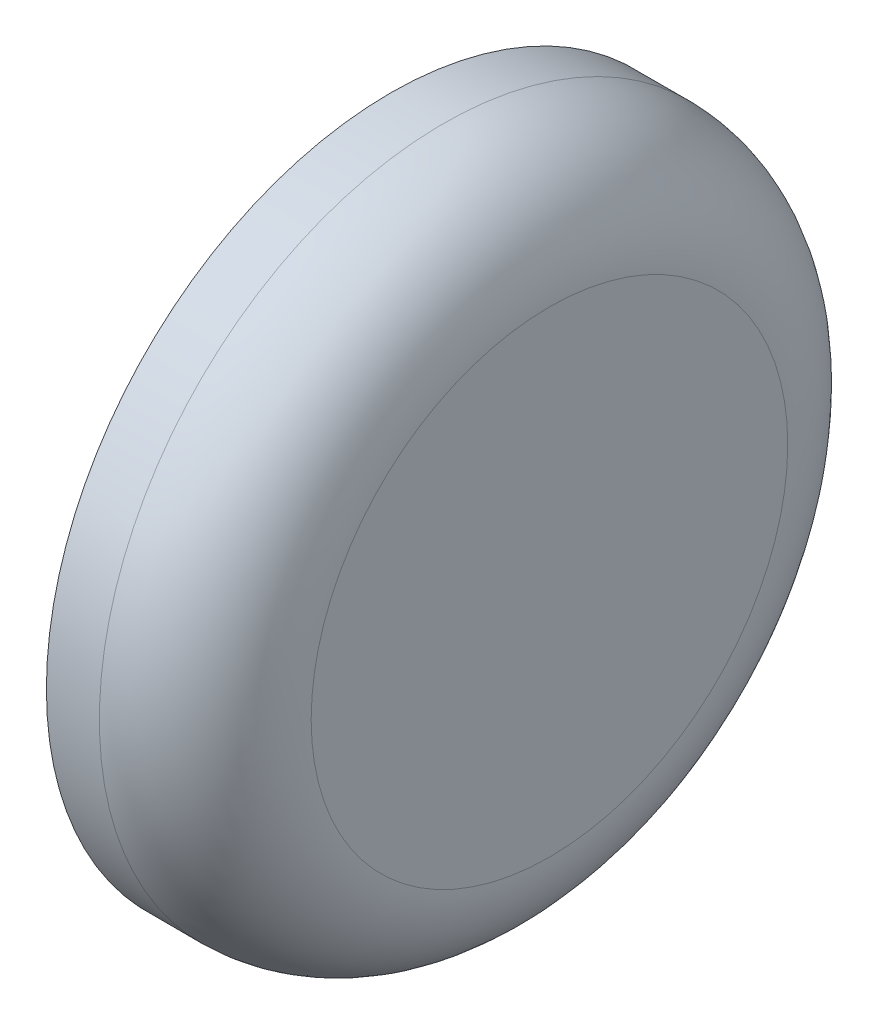
ISO-10303-21;
HEADER;
FILE_DESCRIPTION(('STEP AP214'),'2;1');
FILE_NAME('part.step','',(''),(''),'','','');
FILE_SCHEMA(('AUTOMOTIVE_DESIGN { 1 0 10303 214 1 1 1 1 }'));
ENDSEC;
DATA;
#1=APPLICATION_CONTEXT('core data for automotive mechanical design processes');
#2=APPLICATION_PROTOCOL_DEFINITION('international standard','automotive_design',2000,#1);
#3=PRODUCT_CONTEXT('',#1,'mechanical');
#4=PRODUCT('Part','Part','',(#3));
#5=PRODUCT_RELATED_PRODUCT_CATEGORY('part','',(#4));
#6=PRODUCT_DEFINITION_FORMATION('','',#4);
#7=PRODUCT_DEFINITION_CONTEXT('part definition',#1,'design');
#8=PRODUCT_DEFINITION('design','',#6,#7);
#9=PRODUCT_DEFINITION_SHAPE('','',#8);
#10=(LENGTH_UNIT() NAMED_UNIT(*) SI_UNIT(.MILLI.,.METRE.));
#11=(NAMED_UNIT(*) PLANE_ANGLE_UNIT() SI_UNIT($,.RADIAN.));
#12=(NAMED_UNIT(*) SI_UNIT($,.STERADIAN.) SOLID_ANGLE_UNIT());
#13=UNCERTAINTY_MEASURE_WITH_UNIT(LENGTH_MEASURE(1.E-05),#10,'distance_accuracy_value','');
#14=(GEOMETRIC_REPRESENTATION_CONTEXT(3) GLOBAL_UNCERTAINTY_ASSIGNED_CONTEXT((#13)) GLOBAL_UNIT_ASSIGNED_CONTEXT((#10,
#11,#12)) REPRESENTATION_CONTEXT('',''));
#15=CARTESIAN_POINT('',(0.,0.,0.));
#16=DIRECTION('',(0.,0.,1.));
#17=DIRECTION('',(1.,0.,0.));
#18=AXIS2_PLACEMENT_3D('',#15,#16,#17);
#19=CARTESIAN_POINT('',(144.5,0.,-151.25));
#20=DIRECTION('',(1.,0.,0.));
#21=DIRECTION('',(0.,0.,-1.));
#22=AXIS2_PLACEMENT_3D('',#19,#20,#21);
#23=PLANE('',#22);
#24=CARTESIAN_POINT('',(144.5,24.,145.25));
#25=DIRECTION('',(1.,0.,0.));
#26=DIRECTION('',(0.,0.,1.));
#27=AXIS2_PLACEMENT_3D('',#24,#25,#26);
#28=CIRCLE('',#27,3.25);
#29=CARTESIAN_POINT('',(144.5,24.,148.5));
#30=VERTEX_POINT('',#29);
#31=EDGE_CURVE('E26',#30,#30,#28,.T.);
#32=ORIENTED_EDGE('',*,*,#31,.F.);
#33=EDGE_LOOP('',(#32));
#34=FACE_BOUND('',#33,.T.);
#35=ADVANCED_FACE('F15',(#34),#23,.F.);
#36=CARTESIAN_POINT('',(144.5,24.,145.25));
#37=DIRECTION('',(1.,0.,0.));
#38=DIRECTION('',(0.,0.,-1.));
#39=AXIS2_PLACEMENT_3D('',#36,#37,#38);
#40=CYLINDRICAL_SURFACE('',#39,3.25);
#41=CARTESIAN_POINT('',(145.,24.,145.25));
#42=DIRECTION('',(1.,0.,0.));
#43=DIRECTION('',(0.,0.,-1.));
#44=AXIS2_PLACEMENT_3D('',#41,#42,#43);
#45=CIRCLE('',#44,3.25);
#46=CARTESIAN_POINT('',(145.,24.,142.));
#47=VERTEX_POINT('',#46);
#48=EDGE_CURVE('E10',#47,#47,#45,.T.);
#49=ORIENTED_EDGE('',*,*,#48,.F.);
#50=EDGE_LOOP('',(#49));
#51=FACE_BOUND('',#50,.T.);
#52=ORIENTED_EDGE('',*,*,#31,.T.);
#53=EDGE_LOOP('',(#52));
#54=FACE_BOUND('',#53,.T.);
#55=ADVANCED_FACE('F31',(#51,#54),#40,.T.);
#56=CARTESIAN_POINT('',(145.,24.,145.25));
#57=DIRECTION('',(1.,0.,0.));
#58=DIRECTION('',(0.,-0.243150153164411,-0.969988661282246));
#59=AXIS2_PLACEMENT_3D('',#56,#57,#58);
#60=TOROIDAL_SURFACE('',#59,2.25,1.);
#61=ORIENTED_EDGE('',*,*,#48,.T.);
#62=EDGE_LOOP('',(#61));
#63=FACE_BOUND('',#62,.T.);
#64=CARTESIAN_POINT('',(146.,24.,145.25));
#65=DIRECTION('',(1.,0.,0.));
#66=DIRECTION('',(0.,0.,-1.));
#67=AXIS2_PLACEMENT_3D('',#64,#65,#66);
#68=CIRCLE('',#67,2.25);
#69=CARTESIAN_POINT('',(146.,24.,143.));
#70=VERTEX_POINT('',#69);
#71=EDGE_CURVE('E19',#70,#70,#68,.T.);
#72=ORIENTED_EDGE('',*,*,#71,.F.);
#73=EDGE_LOOP('',(#72));
#74=FACE_BOUND('',#73,.T.);
#75=ADVANCED_FACE('F39',(#63,#74),#60,.T.);
#76=CARTESIAN_POINT('',(146.,0.,-151.25));
#77=DIRECTION('',(1.,0.,0.));
#78=DIRECTION('',(0.,0.,-1.));
#79=AXIS2_PLACEMENT_3D('',#76,#77,#78);
#80=PLANE('',#79);
#81=ORIENTED_EDGE('',*,*,#71,.T.);
#82=EDGE_LOOP('',(#81));
#83=FACE_BOUND('',#82,.T.);
#84=ADVANCED_FACE('F17',(#83),#80,.T.);
#85=CLOSED_SHELL('',(#35,#55,#75,#84));
#86=MANIFOLD_SOLID_BREP('B1',#85);
#87=ADVANCED_BREP_SHAPE_REPRESENTATION('',(#18,#86),#14);
#88=SHAPE_DEFINITION_REPRESENTATION(#9,#87);
ENDSEC;
END-ISO-10303-21;
